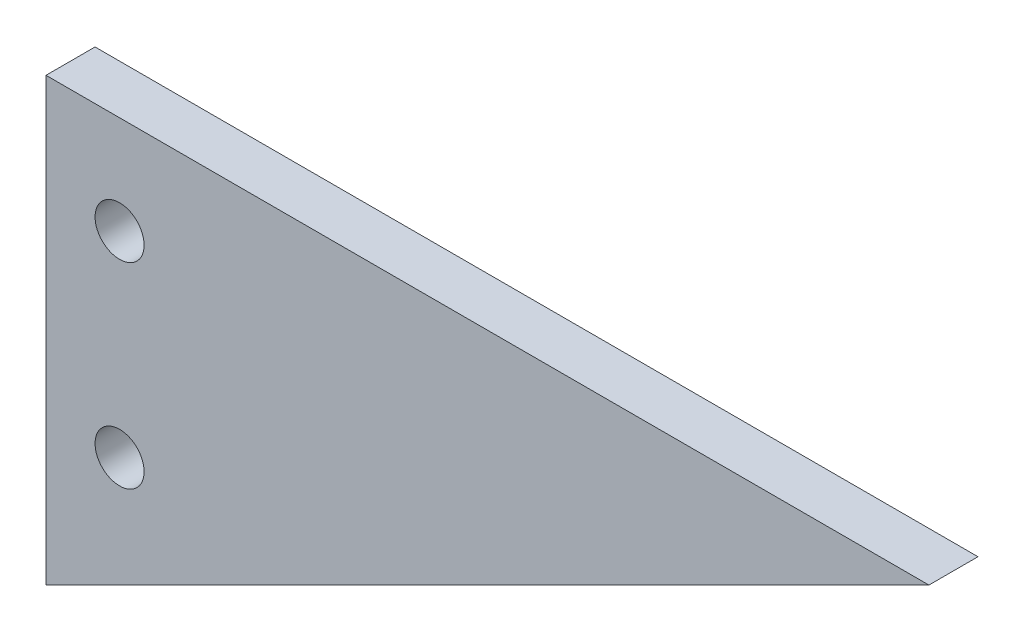
ISO-10303-21;
HEADER;
FILE_DESCRIPTION(('STEP AP214'),'2;1');
FILE_NAME('part.step','',(''),(''),'','','');
FILE_SCHEMA(('AUTOMOTIVE_DESIGN { 1 0 10303 214 1 1 1 1 }'));
ENDSEC;
DATA;
#1=APPLICATION_CONTEXT('core data for automotive mechanical design processes');
#2=APPLICATION_PROTOCOL_DEFINITION('international standard','automotive_design',2000,#1);
#3=PRODUCT_CONTEXT('',#1,'mechanical');
#4=PRODUCT('Part','Part','',(#3));
#5=PRODUCT_RELATED_PRODUCT_CATEGORY('part','',(#4));
#6=PRODUCT_DEFINITION_FORMATION('','',#4);
#7=PRODUCT_DEFINITION_CONTEXT('part definition',#1,'design');
#8=PRODUCT_DEFINITION('design','',#6,#7);
#9=PRODUCT_DEFINITION_SHAPE('','',#8);
#10=(LENGTH_UNIT() NAMED_UNIT(*) SI_UNIT(.MILLI.,.METRE.));
#11=(NAMED_UNIT(*) PLANE_ANGLE_UNIT() SI_UNIT($,.RADIAN.));
#12=(NAMED_UNIT(*) SI_UNIT($,.STERADIAN.) SOLID_ANGLE_UNIT());
#13=UNCERTAINTY_MEASURE_WITH_UNIT(LENGTH_MEASURE(1.E-05),#10,'distance_accuracy_value','');
#14=(GEOMETRIC_REPRESENTATION_CONTEXT(3) GLOBAL_UNCERTAINTY_ASSIGNED_CONTEXT((#13)) GLOBAL_UNIT_ASSIGNED_CONTEXT((#10,
#11,#12)) REPRESENTATION_CONTEXT('',''));
#15=CARTESIAN_POINT('',(0.,0.,0.));
#16=DIRECTION('',(0.,0.,1.));
#17=DIRECTION('',(1.,0.,0.));
#18=AXIS2_PLACEMENT_3D('',#15,#16,#17);
#19=CARTESIAN_POINT('',(0.,-90.,-10.));
#20=DIRECTION('',(-1.,0.,0.));
#21=DIRECTION('',(0.,0.,1.));
#22=AXIS2_PLACEMENT_3D('',#19,#20,#21);
#23=PLANE('',#22);
#24=DIRECTION('',(0.,-1.,0.));
#25=VECTOR('',#24,1.);
#26=CARTESIAN_POINT('',(0.,-90.,0.));
#27=LINE('',#26,#25);
#28=CARTESIAN_POINT('',(0.,0.,0.));
#29=VERTEX_POINT('',#28);
#30=CARTESIAN_POINT('',(0.,-90.,0.));
#31=VERTEX_POINT('',#30);
#32=EDGE_CURVE('E107',#29,#31,#27,.T.);
#33=ORIENTED_EDGE('',*,*,#32,.F.);
#34=DIRECTION('',(0.,0.,1.));
#35=VECTOR('',#34,1.);
#36=CARTESIAN_POINT('',(0.,0.,-10.));
#37=LINE('',#36,#35);
#38=CARTESIAN_POINT('',(0.,0.,-10.));
#39=VERTEX_POINT('',#38);
#40=EDGE_CURVE('E12',#39,#29,#37,.T.);
#41=ORIENTED_EDGE('',*,*,#40,.F.);
#42=DIRECTION('',(0.,-1.,0.));
#43=VECTOR('',#42,1.);
#44=CARTESIAN_POINT('',(0.,-90.,-10.));
#45=LINE('',#44,#43);
#46=CARTESIAN_POINT('',(0.,-90.,-10.));
#47=VERTEX_POINT('',#46);
#48=EDGE_CURVE('E96',#39,#47,#45,.T.);
#49=ORIENTED_EDGE('',*,*,#48,.T.);
#50=DIRECTION('',(0.,0.,1.));
#51=VECTOR('',#50,1.);
#52=CARTESIAN_POINT('',(0.,-90.,-10.));
#53=LINE('',#52,#51);
#54=EDGE_CURVE('E53',#47,#31,#53,.T.);
#55=ORIENTED_EDGE('',*,*,#54,.T.);
#56=EDGE_LOOP('',(#33,#41,#49,#55));
#57=FACE_BOUND('',#56,.T.);
#58=ADVANCED_FACE('F50',(#57),#23,.T.);
#59=CARTESIAN_POINT('',(0.,0.,-10.));
#60=DIRECTION('',(0.,1.,0.));
#61=DIRECTION('',(0.,0.,1.));
#62=AXIS2_PLACEMENT_3D('',#59,#60,#61);
#63=PLANE('',#62);
#64=DIRECTION('',(-1.,0.,0.));
#65=VECTOR('',#64,1.);
#66=CARTESIAN_POINT('',(0.,0.,0.));
#67=LINE('',#66,#65);
#68=CARTESIAN_POINT('',(180.,0.,0.));
#69=VERTEX_POINT('',#68);
#70=EDGE_CURVE('E98',#69,#29,#67,.T.);
#71=ORIENTED_EDGE('',*,*,#70,.F.);
#72=DIRECTION('',(0.,0.,1.));
#73=VECTOR('',#72,1.);
#74=CARTESIAN_POINT('',(180.,0.,-10.));
#75=LINE('',#74,#73);
#76=CARTESIAN_POINT('',(180.,0.,-10.));
#77=VERTEX_POINT('',#76);
#78=EDGE_CURVE('E60',#77,#69,#75,.T.);
#79=ORIENTED_EDGE('',*,*,#78,.F.);
#80=DIRECTION('',(-1.,0.,0.));
#81=VECTOR('',#80,1.);
#82=CARTESIAN_POINT('',(0.,0.,-10.));
#83=LINE('',#82,#81);
#84=EDGE_CURVE('E93',#77,#39,#83,.T.);
#85=ORIENTED_EDGE('',*,*,#84,.T.);
#86=ORIENTED_EDGE('',*,*,#40,.T.);
#87=EDGE_LOOP('',(#71,#79,#85,#86));
#88=FACE_BOUND('',#87,.T.);
#89=ADVANCED_FACE('F114',(#88),#63,.T.);
#90=CARTESIAN_POINT('',(180.,0.,-10.));
#91=DIRECTION('',(0.447213595499958,-0.894427190999916,0.));
#92=DIRECTION('',(0.894427190999916,0.447213595499958,0.));
#93=AXIS2_PLACEMENT_3D('',#90,#91,#92);
#94=PLANE('',#93);
#95=DIRECTION('',(0.894427190999916,0.447213595499958,0.));
#96=VECTOR('',#95,1.);
#97=CARTESIAN_POINT('',(180.,0.,0.));
#98=LINE('',#97,#96);
#99=EDGE_CURVE('E91',#31,#69,#98,.T.);
#100=ORIENTED_EDGE('',*,*,#99,.F.);
#101=ORIENTED_EDGE('',*,*,#54,.F.);
#102=DIRECTION('',(0.894427190999916,0.447213595499958,0.));
#103=VECTOR('',#102,1.);
#104=CARTESIAN_POINT('',(180.,0.,-10.));
#105=LINE('',#104,#103);
#106=EDGE_CURVE('E89',#47,#77,#105,.T.);
#107=ORIENTED_EDGE('',*,*,#106,.T.);
#108=ORIENTED_EDGE('',*,*,#78,.T.);
#109=EDGE_LOOP('',(#100,#101,#107,#108));
#110=FACE_BOUND('',#109,.T.);
#111=ADVANCED_FACE('F88',(#110),#94,.T.);
#112=CARTESIAN_POINT('',(0.,0.,-10.));
#113=DIRECTION('',(0.,0.,-1.));
#114=DIRECTION('',(-1.,0.,0.));
#115=AXIS2_PLACEMENT_3D('',#112,#113,#114);
#116=PLANE('',#115);
#117=CARTESIAN_POINT('',(15.,-20.,-10.));
#118=DIRECTION('',(0.,0.,1.));
#119=DIRECTION('',(1.,0.,0.));
#120=AXIS2_PLACEMENT_3D('',#117,#118,#119);
#121=CIRCLE('',#120,5.);
#122=CARTESIAN_POINT('',(20.,-20.,-10.));
#123=VERTEX_POINT('',#122);
#124=EDGE_CURVE('E109',#123,#123,#121,.T.);
#125=ORIENTED_EDGE('',*,*,#124,.T.);
#126=EDGE_LOOP('',(#125));
#127=FACE_BOUND('',#126,.T.);
#128=CARTESIAN_POINT('',(15.,-60.,-10.));
#129=DIRECTION('',(0.,0.,1.));
#130=DIRECTION('',(1.,0.,0.));
#131=AXIS2_PLACEMENT_3D('',#128,#129,#130);
#132=CIRCLE('',#131,5.);
#133=CARTESIAN_POINT('',(20.,-60.,-10.));
#134=VERTEX_POINT('',#133);
#135=EDGE_CURVE('E143',#134,#134,#132,.T.);
#136=ORIENTED_EDGE('',*,*,#135,.T.);
#137=EDGE_LOOP('',(#136));
#138=FACE_BOUND('',#137,.T.);
#139=ORIENTED_EDGE('',*,*,#48,.F.);
#140=ORIENTED_EDGE('',*,*,#84,.F.);
#141=ORIENTED_EDGE('',*,*,#106,.F.);
#142=EDGE_LOOP('',(#139,#140,#141));
#143=FACE_BOUND('',#142,.T.);
#144=ADVANCED_FACE('F95',(#127,#138,#143),#116,.T.);
#145=CARTESIAN_POINT('',(0.,0.,0.));
#146=DIRECTION('',(0.,0.,-1.));
#147=DIRECTION('',(-1.,0.,0.));
#148=AXIS2_PLACEMENT_3D('',#145,#146,#147);
#149=PLANE('',#148);
#150=CARTESIAN_POINT('',(15.,-20.,0.));
#151=DIRECTION('',(0.,0.,1.));
#152=DIRECTION('',(1.,0.,0.));
#153=AXIS2_PLACEMENT_3D('',#150,#151,#152);
#154=CIRCLE('',#153,5.);
#155=CARTESIAN_POINT('',(20.,-20.,0.));
#156=VERTEX_POINT('',#155);
#157=EDGE_CURVE('E142',#156,#156,#154,.T.);
#158=ORIENTED_EDGE('',*,*,#157,.F.);
#159=EDGE_LOOP('',(#158));
#160=FACE_BOUND('',#159,.T.);
#161=CARTESIAN_POINT('',(15.,-60.,0.));
#162=DIRECTION('',(0.,0.,1.));
#163=DIRECTION('',(1.,0.,0.));
#164=AXIS2_PLACEMENT_3D('',#161,#162,#163);
#165=CIRCLE('',#164,5.);
#166=CARTESIAN_POINT('',(20.,-60.,0.));
#167=VERTEX_POINT('',#166);
#168=EDGE_CURVE('E103',#167,#167,#165,.T.);
#169=ORIENTED_EDGE('',*,*,#168,.F.);
#170=EDGE_LOOP('',(#169));
#171=FACE_BOUND('',#170,.T.);
#172=ORIENTED_EDGE('',*,*,#32,.T.);
#173=ORIENTED_EDGE('',*,*,#99,.T.);
#174=ORIENTED_EDGE('',*,*,#70,.T.);
#175=EDGE_LOOP('',(#172,#173,#174));
#176=FACE_BOUND('',#175,.T.);
#177=ADVANCED_FACE('F113',(#160,#171,#176),#149,.F.);
#178=CARTESIAN_POINT('',(15.,-60.,-10.));
#179=DIRECTION('',(0.,0.,1.));
#180=DIRECTION('',(1.,0.,0.));
#181=AXIS2_PLACEMENT_3D('',#178,#179,#180);
#182=CYLINDRICAL_SURFACE('',#181,5.);
#183=ORIENTED_EDGE('',*,*,#135,.F.);
#184=EDGE_LOOP('',(#183));
#185=FACE_BOUND('',#184,.T.);
#186=ORIENTED_EDGE('',*,*,#168,.T.);
#187=EDGE_LOOP('',(#186));
#188=FACE_BOUND('',#187,.T.);
#189=ADVANCED_FACE('F124',(#185,#188),#182,.F.);
#190=CARTESIAN_POINT('',(15.,-20.,-10.));
#191=DIRECTION('',(0.,0.,1.));
#192=DIRECTION('',(1.,0.,0.));
#193=AXIS2_PLACEMENT_3D('',#190,#191,#192);
#194=CYLINDRICAL_SURFACE('',#193,5.);
#195=ORIENTED_EDGE('',*,*,#124,.F.);
#196=EDGE_LOOP('',(#195));
#197=FACE_BOUND('',#196,.T.);
#198=ORIENTED_EDGE('',*,*,#157,.T.);
#199=EDGE_LOOP('',(#198));
#200=FACE_BOUND('',#199,.T.);
#201=ADVANCED_FACE('F131',(#197,#200),#194,.F.);
#202=CLOSED_SHELL('',(#58,#89,#111,#144,#177,#189,#201));
#203=MANIFOLD_SOLID_BREP('B2',#202);
#204=ADVANCED_BREP_SHAPE_REPRESENTATION('',(#18,#203),#14);
#205=SHAPE_DEFINITION_REPRESENTATION(#9,#204);
ENDSEC;
END-ISO-10303-21;
